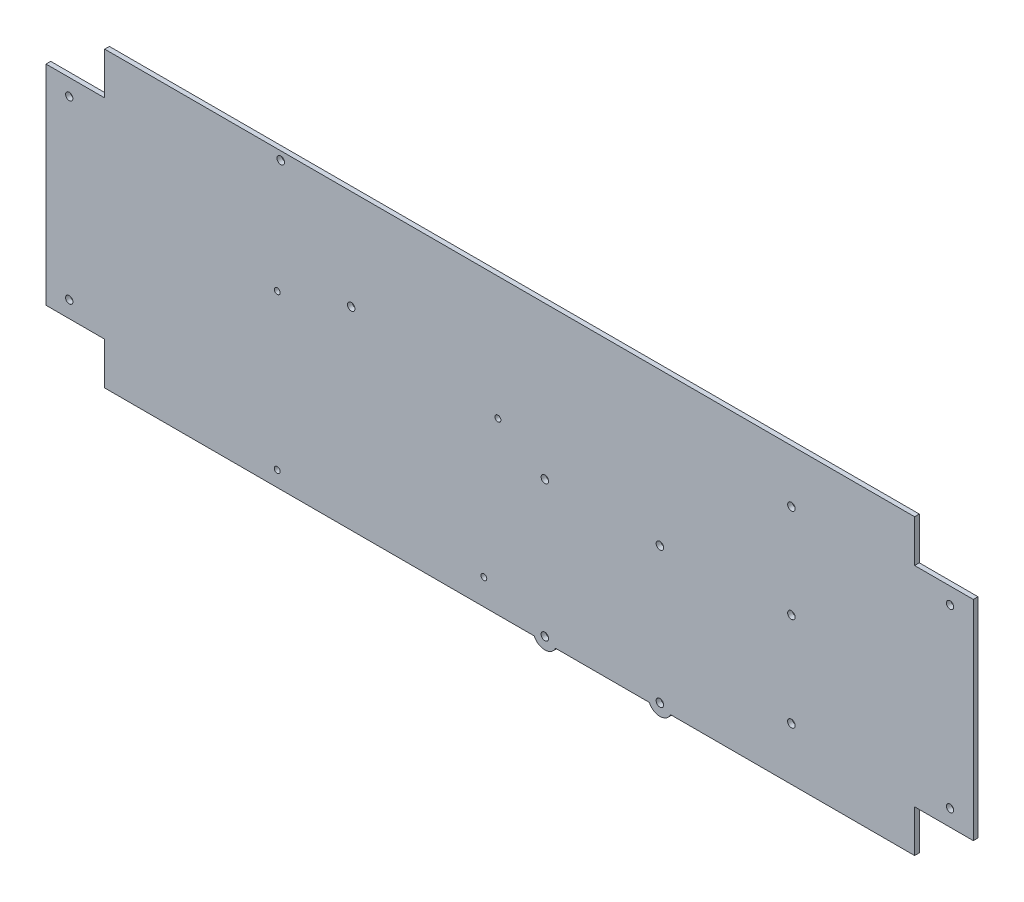
ISO-10303-21;
HEADER;
FILE_DESCRIPTION(('STEP AP214'),'2;1');
FILE_NAME('part.step','',(''),(''),'','','');
FILE_SCHEMA(('AUTOMOTIVE_DESIGN { 1 0 10303 214 1 1 1 1 }'));
ENDSEC;
DATA;
#1=APPLICATION_CONTEXT('core data for automotive mechanical design processes');
#2=APPLICATION_PROTOCOL_DEFINITION('international standard','automotive_design',2000,#1);
#3=PRODUCT_CONTEXT('',#1,'mechanical');
#4=PRODUCT('Part','Part','',(#3));
#5=PRODUCT_RELATED_PRODUCT_CATEGORY('part','',(#4));
#6=PRODUCT_DEFINITION_FORMATION('','',#4);
#7=PRODUCT_DEFINITION_CONTEXT('part definition',#1,'design');
#8=PRODUCT_DEFINITION('design','',#6,#7);
#9=PRODUCT_DEFINITION_SHAPE('','',#8);
#10=(LENGTH_UNIT() NAMED_UNIT(*) SI_UNIT(.MILLI.,.METRE.));
#11=(NAMED_UNIT(*) PLANE_ANGLE_UNIT() SI_UNIT($,.RADIAN.));
#12=(NAMED_UNIT(*) SI_UNIT($,.STERADIAN.) SOLID_ANGLE_UNIT());
#13=UNCERTAINTY_MEASURE_WITH_UNIT(LENGTH_MEASURE(1.E-05),#10,'distance_accuracy_value','');
#14=(GEOMETRIC_REPRESENTATION_CONTEXT(3) GLOBAL_UNCERTAINTY_ASSIGNED_CONTEXT((#13)) GLOBAL_UNIT_ASSIGNED_CONTEXT((#10,
#11,#12)) REPRESENTATION_CONTEXT('',''));
#15=CARTESIAN_POINT('',(0.,0.,0.));
#16=DIRECTION('',(0.,0.,1.));
#17=DIRECTION('',(1.,0.,0.));
#18=AXIS2_PLACEMENT_3D('',#15,#16,#17);
#19=CARTESIAN_POINT('',(-197.5,-62.5,2.));
#20=DIRECTION('',(0.,1.,0.));
#21=DIRECTION('',(0.,0.,1.));
#22=AXIS2_PLACEMENT_3D('',#19,#20,#21);
#23=PLANE('',#22);
#24=DIRECTION('',(1.,0.,0.));
#25=VECTOR('',#24,1.);
#26=CARTESIAN_POINT('',(-197.5,-62.5,0.));
#27=LINE('',#26,#25);
#28=CARTESIAN_POINT('',(-172.5,-62.5,0.));
#29=VERTEX_POINT('',#28);
#30=CARTESIAN_POINT('',(10.4623794781846,-62.5,0.));
#31=VERTEX_POINT('',#30);
#32=EDGE_CURVE('E39',#29,#31,#27,.T.);
#33=ORIENTED_EDGE('',*,*,#32,.T.);
#34=DIRECTION('',(0.,0.,1.));
#35=VECTOR('',#34,1.);
#36=CARTESIAN_POINT('',(10.4623794781846,-62.5,-9.52732911156111));
#37=LINE('',#36,#35);
#38=CARTESIAN_POINT('',(10.4623794781846,-62.5,2.));
#39=VERTEX_POINT('',#38);
#40=EDGE_CURVE('E60',#31,#39,#37,.T.);
#41=ORIENTED_EDGE('',*,*,#40,.T.);
#42=DIRECTION('',(1.,0.,0.));
#43=VECTOR('',#42,1.);
#44=CARTESIAN_POINT('',(-197.5,-62.5,2.));
#45=LINE('',#44,#43);
#46=CARTESIAN_POINT('',(-172.5,-62.5,2.));
#47=VERTEX_POINT('',#46);
#48=EDGE_CURVE('E11',#47,#39,#45,.T.);
#49=ORIENTED_EDGE('',*,*,#48,.F.);
#50=DIRECTION('',(0.,0.,1.));
#51=VECTOR('',#50,1.);
#52=CARTESIAN_POINT('',(-172.5,-62.5,0.));
#53=LINE('',#52,#51);
#54=EDGE_CURVE('E303',#29,#47,#53,.T.);
#55=ORIENTED_EDGE('',*,*,#54,.F.);
#56=EDGE_LOOP('',(#33,#41,#49,#55));
#57=FACE_BOUND('',#56,.T.);
#58=ADVANCED_FACE('F35',(#57),#23,.F.);
#59=CARTESIAN_POINT('',(19.5376205218153,-62.5,2.));
#60=VERTEX_POINT('',#59);
#61=CARTESIAN_POINT('',(59.4623794781845,-62.5,2.));
#62=VERTEX_POINT('',#61);
#63=EDGE_CURVE('E44',#60,#62,#45,.T.);
#64=ORIENTED_EDGE('',*,*,#63,.F.);
#65=DIRECTION('',(0.,0.,1.));
#66=VECTOR('',#65,1.);
#67=CARTESIAN_POINT('',(19.5376205218154,-62.5,-9.52732911156111));
#68=LINE('',#67,#66);
#69=CARTESIAN_POINT('',(19.5376205218154,-62.5,0.));
#70=VERTEX_POINT('',#69);
#71=EDGE_CURVE('E161',#70,#60,#68,.T.);
#72=ORIENTED_EDGE('',*,*,#71,.F.);
#73=CARTESIAN_POINT('',(59.4623794781845,-62.5,0.));
#74=VERTEX_POINT('',#73);
#75=EDGE_CURVE('E151',#70,#74,#27,.T.);
#76=ORIENTED_EDGE('',*,*,#75,.T.);
#77=DIRECTION('',(0.,0.,1.));
#78=VECTOR('',#77,1.);
#79=CARTESIAN_POINT('',(59.4623794781846,-62.5,-9.52732911156111));
#80=LINE('',#79,#78);
#81=EDGE_CURVE('E178',#74,#62,#80,.T.);
#82=ORIENTED_EDGE('',*,*,#81,.T.);
#83=EDGE_LOOP('',(#64,#72,#76,#82));
#84=FACE_BOUND('',#83,.T.);
#85=ADVANCED_FACE('F162',(#84),#23,.F.);
#86=CARTESIAN_POINT('',(0.,0.,2.));
#87=DIRECTION('',(0.,0.,1.));
#88=DIRECTION('',(1.,0.,0.));
#89=AXIS2_PLACEMENT_3D('',#86,#87,#88);
#90=PLANE('',#89);
#91=CARTESIAN_POINT('',(120.,-40.,2.));
#92=DIRECTION('',(0.,0.,1.));
#93=DIRECTION('',(1.,0.,0.));
#94=AXIS2_PLACEMENT_3D('',#91,#92,#93);
#95=CIRCLE('',#94,1.59999999999999);
#96=CARTESIAN_POINT('',(121.6,-40.,2.));
#97=VERTEX_POINT('',#96);
#98=EDGE_CURVE('E177',#97,#97,#95,.T.);
#99=ORIENTED_EDGE('',*,*,#98,.F.);
#100=EDGE_LOOP('',(#99));
#101=FACE_BOUND('',#100,.T.);
#102=CARTESIAN_POINT('',(120.,40.,2.));
#103=DIRECTION('',(0.,0.,1.));
#104=DIRECTION('',(1.,0.,0.));
#105=AXIS2_PLACEMENT_3D('',#102,#103,#104);
#106=CIRCLE('',#105,1.59999999999999);
#107=CARTESIAN_POINT('',(121.6,40.,2.));
#108=VERTEX_POINT('',#107);
#109=EDGE_CURVE('E186',#108,#108,#106,.T.);
#110=ORIENTED_EDGE('',*,*,#109,.F.);
#111=EDGE_LOOP('',(#110));
#112=FACE_BOUND('',#111,.T.);
#113=CARTESIAN_POINT('',(120.,0.,2.));
#114=DIRECTION('',(0.,0.,1.));
#115=DIRECTION('',(1.,0.,0.));
#116=AXIS2_PLACEMENT_3D('',#113,#114,#115);
#117=CIRCLE('',#116,1.59999999999999);
#118=CARTESIAN_POINT('',(121.6,0.,2.));
#119=VERTEX_POINT('',#118);
#120=EDGE_CURVE('E192',#119,#119,#117,.T.);
#121=ORIENTED_EDGE('',*,*,#120,.F.);
#122=EDGE_LOOP('',(#121));
#123=FACE_BOUND('',#122,.T.);
#124=CARTESIAN_POINT('',(-67.5,20.,2.));
#125=DIRECTION('',(0.,0.,1.));
#126=DIRECTION('',(1.,0.,0.));
#127=AXIS2_PLACEMENT_3D('',#124,#125,#126);
#128=CIRCLE('',#127,1.6);
#129=CARTESIAN_POINT('',(-65.9,20.,2.));
#130=VERTEX_POINT('',#129);
#131=EDGE_CURVE('E198',#130,#130,#128,.T.);
#132=ORIENTED_EDGE('',*,*,#131,.F.);
#133=EDGE_LOOP('',(#132));
#134=FACE_BOUND('',#133,.T.);
#135=CARTESIAN_POINT('',(-97.5,59.,2.));
#136=DIRECTION('',(0.,0.,1.));
#137=DIRECTION('',(1.,0.,0.));
#138=AXIS2_PLACEMENT_3D('',#135,#136,#137);
#139=CIRCLE('',#138,1.60000000000001);
#140=CARTESIAN_POINT('',(-95.9,59.,2.));
#141=VERTEX_POINT('',#140);
#142=EDGE_CURVE('E204',#141,#141,#139,.T.);
#143=ORIENTED_EDGE('',*,*,#142,.F.);
#144=EDGE_LOOP('',(#143));
#145=FACE_BOUND('',#144,.T.);
#146=CARTESIAN_POINT('',(64.,-60.4,2.));
#147=DIRECTION('',(0.,0.,1.));
#148=DIRECTION('',(1.,0.,0.));
#149=AXIS2_PLACEMENT_3D('',#146,#147,#148);
#150=CIRCLE('',#149,1.60000000000001);
#151=CARTESIAN_POINT('',(65.6,-60.4,2.));
#152=VERTEX_POINT('',#151);
#153=EDGE_CURVE('E210',#152,#152,#150,.T.);
#154=ORIENTED_EDGE('',*,*,#153,.F.);
#155=EDGE_LOOP('',(#154));
#156=FACE_BOUND('',#155,.T.);
#157=CARTESIAN_POINT('',(64.,-2.4,2.));
#158=DIRECTION('',(0.,0.,1.));
#159=DIRECTION('',(1.,0.,0.));
#160=AXIS2_PLACEMENT_3D('',#157,#158,#159);
#161=CIRCLE('',#160,1.59999999999999);
#162=CARTESIAN_POINT('',(65.6,-2.4,2.));
#163=VERTEX_POINT('',#162);
#164=EDGE_CURVE('E216',#163,#163,#161,.T.);
#165=ORIENTED_EDGE('',*,*,#164,.F.);
#166=EDGE_LOOP('',(#165));
#167=FACE_BOUND('',#166,.T.);
#168=CARTESIAN_POINT('',(15.,-60.4,2.));
#169=DIRECTION('',(0.,0.,1.));
#170=DIRECTION('',(1.,0.,0.));
#171=AXIS2_PLACEMENT_3D('',#168,#169,#170);
#172=CIRCLE('',#171,1.6);
#173=CARTESIAN_POINT('',(16.6,-60.4,2.));
#174=VERTEX_POINT('',#173);
#175=EDGE_CURVE('E222',#174,#174,#172,.T.);
#176=ORIENTED_EDGE('',*,*,#175,.F.);
#177=EDGE_LOOP('',(#176));
#178=FACE_BOUND('',#177,.T.);
#179=CARTESIAN_POINT('',(15.,-2.4,2.));
#180=DIRECTION('',(0.,0.,1.));
#181=DIRECTION('',(1.,0.,0.));
#182=AXIS2_PLACEMENT_3D('',#179,#180,#181);
#183=CIRCLE('',#182,1.6);
#184=CARTESIAN_POINT('',(16.6,-2.4,2.));
#185=VERTEX_POINT('',#184);
#186=EDGE_CURVE('E228',#185,#185,#183,.T.);
#187=ORIENTED_EDGE('',*,*,#186,.F.);
#188=EDGE_LOOP('',(#187));
#189=FACE_BOUND('',#188,.T.);
#190=CARTESIAN_POINT('',(-11.,-51.5,2.));
#191=DIRECTION('',(0.,0.,1.));
#192=DIRECTION('',(1.,0.,0.));
#193=AXIS2_PLACEMENT_3D('',#190,#191,#192);
#194=CIRCLE('',#193,1.25);
#195=CARTESIAN_POINT('',(-9.75,-51.5,2.));
#196=VERTEX_POINT('',#195);
#197=EDGE_CURVE('E234',#196,#196,#194,.T.);
#198=ORIENTED_EDGE('',*,*,#197,.F.);
#199=EDGE_LOOP('',(#198));
#200=FACE_BOUND('',#199,.T.);
#201=CARTESIAN_POINT('',(-5.,10.,2.));
#202=DIRECTION('',(0.,0.,1.));
#203=DIRECTION('',(1.,0.,0.));
#204=AXIS2_PLACEMENT_3D('',#201,#202,#203);
#205=CIRCLE('',#204,1.25);
#206=CARTESIAN_POINT('',(-3.75,10.,2.));
#207=VERTEX_POINT('',#206);
#208=EDGE_CURVE('E240',#207,#207,#205,.T.);
#209=ORIENTED_EDGE('',*,*,#208,.F.);
#210=EDGE_LOOP('',(#209));
#211=FACE_BOUND('',#210,.T.);
#212=CARTESIAN_POINT('',(-99.,-56.,2.));
#213=DIRECTION('',(0.,0.,1.));
#214=DIRECTION('',(1.,0.,0.));
#215=AXIS2_PLACEMENT_3D('',#212,#213,#214);
#216=CIRCLE('',#215,1.25);
#217=CARTESIAN_POINT('',(-97.75,-56.,2.));
#218=VERTEX_POINT('',#217);
#219=EDGE_CURVE('E246',#218,#218,#216,.T.);
#220=ORIENTED_EDGE('',*,*,#219,.F.);
#221=EDGE_LOOP('',(#220));
#222=FACE_BOUND('',#221,.T.);
#223=CARTESIAN_POINT('',(-99.,10.,2.));
#224=DIRECTION('',(0.,0.,1.));
#225=DIRECTION('',(1.,0.,0.));
#226=AXIS2_PLACEMENT_3D('',#223,#224,#225);
#227=CIRCLE('',#226,1.25);
#228=CARTESIAN_POINT('',(-97.75,10.,2.));
#229=VERTEX_POINT('',#228);
#230=EDGE_CURVE('E252',#229,#229,#227,.T.);
#231=ORIENTED_EDGE('',*,*,#230,.F.);
#232=EDGE_LOOP('',(#231));
#233=FACE_BOUND('',#232,.T.);
#234=CARTESIAN_POINT('',(187.6,-37.5,2.));
#235=DIRECTION('',(0.,0.,1.));
#236=DIRECTION('',(1.,0.,0.));
#237=AXIS2_PLACEMENT_3D('',#234,#235,#236);
#238=CIRCLE('',#237,1.54999999999999);
#239=CARTESIAN_POINT('',(189.15,-37.5,2.));
#240=VERTEX_POINT('',#239);
#241=EDGE_CURVE('E330',#240,#240,#238,.T.);
#242=ORIENTED_EDGE('',*,*,#241,.F.);
#243=EDGE_LOOP('',(#242));
#244=FACE_BOUND('',#243,.T.);
#245=CARTESIAN_POINT('',(187.6,37.5,2.));
#246=DIRECTION('',(0.,0.,1.));
#247=DIRECTION('',(1.,0.,0.));
#248=AXIS2_PLACEMENT_3D('',#245,#246,#247);
#249=CIRCLE('',#248,1.54999999999999);
#250=CARTESIAN_POINT('',(189.15,37.5,2.));
#251=VERTEX_POINT('',#250);
#252=EDGE_CURVE('E337',#251,#251,#249,.T.);
#253=ORIENTED_EDGE('',*,*,#252,.F.);
#254=EDGE_LOOP('',(#253));
#255=FACE_BOUND('',#254,.T.);
#256=CARTESIAN_POINT('',(-187.6,-37.5,2.));
#257=DIRECTION('',(0.,0.,1.));
#258=DIRECTION('',(1.,0.,0.));
#259=AXIS2_PLACEMENT_3D('',#256,#257,#258);
#260=CIRCLE('',#259,1.55);
#261=CARTESIAN_POINT('',(-186.05,-37.5,2.));
#262=VERTEX_POINT('',#261);
#263=EDGE_CURVE('E343',#262,#262,#260,.T.);
#264=ORIENTED_EDGE('',*,*,#263,.F.);
#265=EDGE_LOOP('',(#264));
#266=FACE_BOUND('',#265,.T.);
#267=CARTESIAN_POINT('',(-187.6,37.5,2.));
#268=DIRECTION('',(0.,0.,1.));
#269=DIRECTION('',(1.,0.,0.));
#270=AXIS2_PLACEMENT_3D('',#267,#268,#269);
#271=CIRCLE('',#270,1.55);
#272=CARTESIAN_POINT('',(-186.05,37.5,2.));
#273=VERTEX_POINT('',#272);
#274=EDGE_CURVE('E349',#273,#273,#271,.T.);
#275=ORIENTED_EDGE('',*,*,#274,.F.);
#276=EDGE_LOOP('',(#275));
#277=FACE_BOUND('',#276,.T.);
#278=DIRECTION('',(0.,1.,0.));
#279=VECTOR('',#278,1.);
#280=CARTESIAN_POINT('',(197.5,62.5,2.));
#281=LINE('',#280,#279);
#282=CARTESIAN_POINT('',(197.5,-44.5,2.));
#283=VERTEX_POINT('',#282);
#284=CARTESIAN_POINT('',(197.5,44.5,2.));
#285=VERTEX_POINT('',#284);
#286=EDGE_CURVE('E358',#283,#285,#281,.T.);
#287=ORIENTED_EDGE('',*,*,#286,.T.);
#288=DIRECTION('',(-1.,0.,0.));
#289=VECTOR('',#288,1.);
#290=CARTESIAN_POINT('',(197.5,44.5,2.));
#291=LINE('',#290,#289);
#292=CARTESIAN_POINT('',(172.5,44.5,2.));
#293=VERTEX_POINT('',#292);
#294=EDGE_CURVE('E264',#285,#293,#291,.T.);
#295=ORIENTED_EDGE('',*,*,#294,.T.);
#296=DIRECTION('',(0.,1.,0.));
#297=VECTOR('',#296,1.);
#298=CARTESIAN_POINT('',(172.5,62.5,2.));
#299=LINE('',#298,#297);
#300=CARTESIAN_POINT('',(172.5,62.5,2.));
#301=VERTEX_POINT('',#300);
#302=EDGE_CURVE('E258',#293,#301,#299,.T.);
#303=ORIENTED_EDGE('',*,*,#302,.T.);
#304=DIRECTION('',(-1.,0.,0.));
#305=VECTOR('',#304,1.);
#306=CARTESIAN_POINT('',(-197.5,62.5,2.));
#307=LINE('',#306,#305);
#308=CARTESIAN_POINT('',(-172.5,62.5,2.));
#309=VERTEX_POINT('',#308);
#310=EDGE_CURVE('E361',#301,#309,#307,.T.);
#311=ORIENTED_EDGE('',*,*,#310,.T.);
#312=DIRECTION('',(0.,1.,0.));
#313=VECTOR('',#312,1.);
#314=CARTESIAN_POINT('',(-172.5,62.5,2.));
#315=LINE('',#314,#313);
#316=CARTESIAN_POINT('',(-172.5,44.5,2.));
#317=VERTEX_POINT('',#316);
#318=EDGE_CURVE('E319',#317,#309,#315,.T.);
#319=ORIENTED_EDGE('',*,*,#318,.F.);
#320=DIRECTION('',(1.,0.,0.));
#321=VECTOR('',#320,1.);
#322=CARTESIAN_POINT('',(-197.5,44.5,2.));
#323=LINE('',#322,#321);
#324=CARTESIAN_POINT('',(-197.5,44.5,2.));
#325=VERTEX_POINT('',#324);
#326=EDGE_CURVE('E311',#325,#317,#323,.T.);
#327=ORIENTED_EDGE('',*,*,#326,.F.);
#328=DIRECTION('',(0.,-1.,0.));
#329=VECTOR('',#328,1.);
#330=CARTESIAN_POINT('',(-197.5,62.5,2.));
#331=LINE('',#330,#329);
#332=CARTESIAN_POINT('',(-197.5,-44.5,2.));
#333=VERTEX_POINT('',#332);
#334=EDGE_CURVE('E363',#325,#333,#331,.T.);
#335=ORIENTED_EDGE('',*,*,#334,.T.);
#336=DIRECTION('',(1.,0.,0.));
#337=VECTOR('',#336,1.);
#338=CARTESIAN_POINT('',(-197.5,-44.5,2.));
#339=LINE('',#338,#337);
#340=CARTESIAN_POINT('',(-172.5,-44.5,2.));
#341=VERTEX_POINT('',#340);
#342=EDGE_CURVE('E300',#333,#341,#339,.T.);
#343=ORIENTED_EDGE('',*,*,#342,.T.);
#344=DIRECTION('',(0.,-1.,0.));
#345=VECTOR('',#344,1.);
#346=CARTESIAN_POINT('',(-172.5,-62.5,2.));
#347=LINE('',#346,#345);
#348=EDGE_CURVE('E293',#341,#47,#347,.T.);
#349=ORIENTED_EDGE('',*,*,#348,.T.);
#350=ORIENTED_EDGE('',*,*,#48,.T.);
#351=CARTESIAN_POINT('',(15.,-60.4,2.));
#352=DIRECTION('',(0.,0.,1.));
#353=DIRECTION('',(1.,0.,0.));
#354=AXIS2_PLACEMENT_3D('',#351,#352,#353);
#355=CIRCLE('',#354,5.);
#356=EDGE_CURVE('E166',#39,#60,#355,.T.);
#357=ORIENTED_EDGE('',*,*,#356,.T.);
#358=ORIENTED_EDGE('',*,*,#63,.T.);
#359=CARTESIAN_POINT('',(64.,-60.4,2.));
#360=DIRECTION('',(0.,0.,1.));
#361=DIRECTION('',(1.,0.,0.));
#362=AXIS2_PLACEMENT_3D('',#359,#360,#361);
#363=CIRCLE('',#362,4.99999999999999);
#364=CARTESIAN_POINT('',(68.5376205218153,-62.5,2.));
#365=VERTEX_POINT('',#364);
#366=EDGE_CURVE('E169',#62,#365,#363,.T.);
#367=ORIENTED_EDGE('',*,*,#366,.T.);
#368=CARTESIAN_POINT('',(172.5,-62.5,2.));
#369=VERTEX_POINT('',#368);
#370=EDGE_CURVE('E46',#365,#369,#45,.T.);
#371=ORIENTED_EDGE('',*,*,#370,.T.);
#372=DIRECTION('',(0.,-1.,0.));
#373=VECTOR('',#372,1.);
#374=CARTESIAN_POINT('',(172.5,-62.5,2.));
#375=LINE('',#374,#373);
#376=CARTESIAN_POINT('',(172.5,-44.5,2.));
#377=VERTEX_POINT('',#376);
#378=EDGE_CURVE('E282',#377,#369,#375,.T.);
#379=ORIENTED_EDGE('',*,*,#378,.F.);
#380=DIRECTION('',(-1.,0.,0.));
#381=VECTOR('',#380,1.);
#382=CARTESIAN_POINT('',(197.5,-44.5,2.));
#383=LINE('',#382,#381);
#384=EDGE_CURVE('E274',#283,#377,#383,.T.);
#385=ORIENTED_EDGE('',*,*,#384,.F.);
#386=EDGE_LOOP('',(#287,#295,#303,#311,#319,#327,#335,#343,#349,#350,#357,#358,#367,#371,#379,#385));
#387=FACE_BOUND('',#386,.T.);
#388=ADVANCED_FACE('F389',(#101,#112,#123,#134,#145,#156,#167,#178,#189,#200,#211,#222,#233,
#244,#255,#266,#277,#387),#90,.T.);
#389=CARTESIAN_POINT('',(0.,0.,0.));
#390=DIRECTION('',(0.,0.,1.));
#391=DIRECTION('',(1.,0.,0.));
#392=AXIS2_PLACEMENT_3D('',#389,#390,#391);
#393=PLANE('',#392);
#394=CARTESIAN_POINT('',(120.,-40.,0.));
#395=DIRECTION('',(0.,0.,1.));
#396=DIRECTION('',(1.,0.,0.));
#397=AXIS2_PLACEMENT_3D('',#394,#395,#396);
#398=CIRCLE('',#397,1.59999999999999);
#399=CARTESIAN_POINT('',(121.6,-40.,0.));
#400=VERTEX_POINT('',#399);
#401=EDGE_CURVE('E183',#400,#400,#398,.T.);
#402=ORIENTED_EDGE('',*,*,#401,.T.);
#403=EDGE_LOOP('',(#402));
#404=FACE_BOUND('',#403,.T.);
#405=CARTESIAN_POINT('',(120.,40.,0.));
#406=DIRECTION('',(0.,0.,1.));
#407=DIRECTION('',(1.,0.,0.));
#408=AXIS2_PLACEMENT_3D('',#405,#406,#407);
#409=CIRCLE('',#408,1.59999999999999);
#410=CARTESIAN_POINT('',(121.6,40.,0.));
#411=VERTEX_POINT('',#410);
#412=EDGE_CURVE('E189',#411,#411,#409,.T.);
#413=ORIENTED_EDGE('',*,*,#412,.T.);
#414=EDGE_LOOP('',(#413));
#415=FACE_BOUND('',#414,.T.);
#416=CARTESIAN_POINT('',(120.,0.,0.));
#417=DIRECTION('',(0.,0.,1.));
#418=DIRECTION('',(1.,0.,0.));
#419=AXIS2_PLACEMENT_3D('',#416,#417,#418);
#420=CIRCLE('',#419,1.59999999999999);
#421=CARTESIAN_POINT('',(121.6,0.,0.));
#422=VERTEX_POINT('',#421);
#423=EDGE_CURVE('E195',#422,#422,#420,.T.);
#424=ORIENTED_EDGE('',*,*,#423,.T.);
#425=EDGE_LOOP('',(#424));
#426=FACE_BOUND('',#425,.T.);
#427=CARTESIAN_POINT('',(-67.5,20.,0.));
#428=DIRECTION('',(0.,0.,1.));
#429=DIRECTION('',(1.,0.,0.));
#430=AXIS2_PLACEMENT_3D('',#427,#428,#429);
#431=CIRCLE('',#430,1.6);
#432=CARTESIAN_POINT('',(-65.9,20.,0.));
#433=VERTEX_POINT('',#432);
#434=EDGE_CURVE('E201',#433,#433,#431,.T.);
#435=ORIENTED_EDGE('',*,*,#434,.T.);
#436=EDGE_LOOP('',(#435));
#437=FACE_BOUND('',#436,.T.);
#438=CARTESIAN_POINT('',(-97.5,59.,0.));
#439=DIRECTION('',(0.,0.,1.));
#440=DIRECTION('',(1.,0.,0.));
#441=AXIS2_PLACEMENT_3D('',#438,#439,#440);
#442=CIRCLE('',#441,1.60000000000001);
#443=CARTESIAN_POINT('',(-95.9,59.,0.));
#444=VERTEX_POINT('',#443);
#445=EDGE_CURVE('E207',#444,#444,#442,.T.);
#446=ORIENTED_EDGE('',*,*,#445,.T.);
#447=EDGE_LOOP('',(#446));
#448=FACE_BOUND('',#447,.T.);
#449=CARTESIAN_POINT('',(64.,-60.4,0.));
#450=DIRECTION('',(0.,0.,1.));
#451=DIRECTION('',(1.,0.,0.));
#452=AXIS2_PLACEMENT_3D('',#449,#450,#451);
#453=CIRCLE('',#452,1.60000000000001);
#454=CARTESIAN_POINT('',(65.6,-60.4,0.));
#455=VERTEX_POINT('',#454);
#456=EDGE_CURVE('E213',#455,#455,#453,.T.);
#457=ORIENTED_EDGE('',*,*,#456,.T.);
#458=EDGE_LOOP('',(#457));
#459=FACE_BOUND('',#458,.T.);
#460=CARTESIAN_POINT('',(64.,-2.4,0.));
#461=DIRECTION('',(0.,0.,1.));
#462=DIRECTION('',(1.,0.,0.));
#463=AXIS2_PLACEMENT_3D('',#460,#461,#462);
#464=CIRCLE('',#463,1.59999999999999);
#465=CARTESIAN_POINT('',(65.6,-2.4,0.));
#466=VERTEX_POINT('',#465);
#467=EDGE_CURVE('E219',#466,#466,#464,.T.);
#468=ORIENTED_EDGE('',*,*,#467,.T.);
#469=EDGE_LOOP('',(#468));
#470=FACE_BOUND('',#469,.T.);
#471=CARTESIAN_POINT('',(15.,-60.4,0.));
#472=DIRECTION('',(0.,0.,1.));
#473=DIRECTION('',(1.,0.,0.));
#474=AXIS2_PLACEMENT_3D('',#471,#472,#473);
#475=CIRCLE('',#474,1.6);
#476=CARTESIAN_POINT('',(16.6,-60.4,0.));
#477=VERTEX_POINT('',#476);
#478=EDGE_CURVE('E225',#477,#477,#475,.T.);
#479=ORIENTED_EDGE('',*,*,#478,.T.);
#480=EDGE_LOOP('',(#479));
#481=FACE_BOUND('',#480,.T.);
#482=CARTESIAN_POINT('',(15.,-2.4,0.));
#483=DIRECTION('',(0.,0.,1.));
#484=DIRECTION('',(1.,0.,0.));
#485=AXIS2_PLACEMENT_3D('',#482,#483,#484);
#486=CIRCLE('',#485,1.6);
#487=CARTESIAN_POINT('',(16.6,-2.4,0.));
#488=VERTEX_POINT('',#487);
#489=EDGE_CURVE('E231',#488,#488,#486,.T.);
#490=ORIENTED_EDGE('',*,*,#489,.T.);
#491=EDGE_LOOP('',(#490));
#492=FACE_BOUND('',#491,.T.);
#493=CARTESIAN_POINT('',(-11.,-51.5,0.));
#494=DIRECTION('',(0.,0.,1.));
#495=DIRECTION('',(1.,0.,0.));
#496=AXIS2_PLACEMENT_3D('',#493,#494,#495);
#497=CIRCLE('',#496,1.25);
#498=CARTESIAN_POINT('',(-9.75,-51.5,0.));
#499=VERTEX_POINT('',#498);
#500=EDGE_CURVE('E237',#499,#499,#497,.T.);
#501=ORIENTED_EDGE('',*,*,#500,.T.);
#502=EDGE_LOOP('',(#501));
#503=FACE_BOUND('',#502,.T.);
#504=CARTESIAN_POINT('',(-5.,10.,0.));
#505=DIRECTION('',(0.,0.,1.));
#506=DIRECTION('',(1.,0.,0.));
#507=AXIS2_PLACEMENT_3D('',#504,#505,#506);
#508=CIRCLE('',#507,1.25);
#509=CARTESIAN_POINT('',(-3.75,10.,0.));
#510=VERTEX_POINT('',#509);
#511=EDGE_CURVE('E243',#510,#510,#508,.T.);
#512=ORIENTED_EDGE('',*,*,#511,.T.);
#513=EDGE_LOOP('',(#512));
#514=FACE_BOUND('',#513,.T.);
#515=CARTESIAN_POINT('',(-99.,-56.,0.));
#516=DIRECTION('',(0.,0.,1.));
#517=DIRECTION('',(1.,0.,0.));
#518=AXIS2_PLACEMENT_3D('',#515,#516,#517);
#519=CIRCLE('',#518,1.25);
#520=CARTESIAN_POINT('',(-97.75,-56.,0.));
#521=VERTEX_POINT('',#520);
#522=EDGE_CURVE('E249',#521,#521,#519,.T.);
#523=ORIENTED_EDGE('',*,*,#522,.T.);
#524=EDGE_LOOP('',(#523));
#525=FACE_BOUND('',#524,.T.);
#526=CARTESIAN_POINT('',(-99.,10.,0.));
#527=DIRECTION('',(0.,0.,1.));
#528=DIRECTION('',(1.,0.,0.));
#529=AXIS2_PLACEMENT_3D('',#526,#527,#528);
#530=CIRCLE('',#529,1.25);
#531=CARTESIAN_POINT('',(-97.75,10.,0.));
#532=VERTEX_POINT('',#531);
#533=EDGE_CURVE('E255',#532,#532,#530,.T.);
#534=ORIENTED_EDGE('',*,*,#533,.T.);
#535=EDGE_LOOP('',(#534));
#536=FACE_BOUND('',#535,.T.);
#537=CARTESIAN_POINT('',(187.6,-37.5,0.));
#538=DIRECTION('',(0.,0.,1.));
#539=DIRECTION('',(1.,0.,0.));
#540=AXIS2_PLACEMENT_3D('',#537,#538,#539);
#541=CIRCLE('',#540,1.54999999999999);
#542=CARTESIAN_POINT('',(189.15,-37.5,0.));
#543=VERTEX_POINT('',#542);
#544=EDGE_CURVE('E334',#543,#543,#541,.T.);
#545=ORIENTED_EDGE('',*,*,#544,.T.);
#546=EDGE_LOOP('',(#545));
#547=FACE_BOUND('',#546,.T.);
#548=CARTESIAN_POINT('',(187.6,37.5,0.));
#549=DIRECTION('',(0.,0.,1.));
#550=DIRECTION('',(1.,0.,0.));
#551=AXIS2_PLACEMENT_3D('',#548,#549,#550);
#552=CIRCLE('',#551,1.54999999999999);
#553=CARTESIAN_POINT('',(189.15,37.5,0.));
#554=VERTEX_POINT('',#553);
#555=EDGE_CURVE('E340',#554,#554,#552,.T.);
#556=ORIENTED_EDGE('',*,*,#555,.T.);
#557=EDGE_LOOP('',(#556));
#558=FACE_BOUND('',#557,.T.);
#559=CARTESIAN_POINT('',(-187.6,-37.5,0.));
#560=DIRECTION('',(0.,0.,1.));
#561=DIRECTION('',(1.,0.,0.));
#562=AXIS2_PLACEMENT_3D('',#559,#560,#561);
#563=CIRCLE('',#562,1.55);
#564=CARTESIAN_POINT('',(-186.05,-37.5,0.));
#565=VERTEX_POINT('',#564);
#566=EDGE_CURVE('E346',#565,#565,#563,.T.);
#567=ORIENTED_EDGE('',*,*,#566,.T.);
#568=EDGE_LOOP('',(#567));
#569=FACE_BOUND('',#568,.T.);
#570=CARTESIAN_POINT('',(-187.6,37.5,0.));
#571=DIRECTION('',(0.,0.,1.));
#572=DIRECTION('',(1.,0.,0.));
#573=AXIS2_PLACEMENT_3D('',#570,#571,#572);
#574=CIRCLE('',#573,1.55);
#575=CARTESIAN_POINT('',(-186.05,37.5,0.));
#576=VERTEX_POINT('',#575);
#577=EDGE_CURVE('E352',#576,#576,#574,.T.);
#578=ORIENTED_EDGE('',*,*,#577,.T.);
#579=EDGE_LOOP('',(#578));
#580=FACE_BOUND('',#579,.T.);
#581=DIRECTION('',(-1.,0.,0.));
#582=VECTOR('',#581,1.);
#583=CARTESIAN_POINT('',(197.5,44.5,0.));
#584=LINE('',#583,#582);
#585=CARTESIAN_POINT('',(197.5,44.5,0.));
#586=VERTEX_POINT('',#585);
#587=CARTESIAN_POINT('',(172.5,44.5,0.));
#588=VERTEX_POINT('',#587);
#589=EDGE_CURVE('E263',#586,#588,#584,.T.);
#590=ORIENTED_EDGE('',*,*,#589,.F.);
#591=DIRECTION('',(0.,1.,0.));
#592=VECTOR('',#591,1.);
#593=CARTESIAN_POINT('',(197.5,62.5,0.));
#594=LINE('',#593,#592);
#595=CARTESIAN_POINT('',(197.5,-44.5,0.));
#596=VERTEX_POINT('',#595);
#597=EDGE_CURVE('E355',#596,#586,#594,.T.);
#598=ORIENTED_EDGE('',*,*,#597,.F.);
#599=DIRECTION('',(-1.,0.,0.));
#600=VECTOR('',#599,1.);
#601=CARTESIAN_POINT('',(197.5,-44.5,0.));
#602=LINE('',#601,#600);
#603=CARTESIAN_POINT('',(172.5,-44.5,0.));
#604=VERTEX_POINT('',#603);
#605=EDGE_CURVE('E278',#596,#604,#602,.T.);
#606=ORIENTED_EDGE('',*,*,#605,.T.);
#607=DIRECTION('',(0.,-1.,0.));
#608=VECTOR('',#607,1.);
#609=CARTESIAN_POINT('',(172.5,-62.5,0.));
#610=LINE('',#609,#608);
#611=CARTESIAN_POINT('',(172.5,-62.5,0.));
#612=VERTEX_POINT('',#611);
#613=EDGE_CURVE('E281',#604,#612,#610,.T.);
#614=ORIENTED_EDGE('',*,*,#613,.T.);
#615=CARTESIAN_POINT('',(68.5376205218154,-62.5,0.));
#616=VERTEX_POINT('',#615);
#617=EDGE_CURVE('E160',#616,#612,#27,.T.);
#618=ORIENTED_EDGE('',*,*,#617,.F.);
#619=CARTESIAN_POINT('',(64.,-60.4,0.));
#620=DIRECTION('',(0.,0.,1.));
#621=DIRECTION('',(1.,0.,0.));
#622=AXIS2_PLACEMENT_3D('',#619,#620,#621);
#623=CIRCLE('',#622,4.99999999999999);
#624=EDGE_CURVE('E158',#616,#74,#623,.F.);
#625=ORIENTED_EDGE('',*,*,#624,.T.);
#626=ORIENTED_EDGE('',*,*,#75,.F.);
#627=CARTESIAN_POINT('',(15.,-60.4,0.));
#628=DIRECTION('',(0.,0.,1.));
#629=DIRECTION('',(1.,0.,0.));
#630=AXIS2_PLACEMENT_3D('',#627,#628,#629);
#631=CIRCLE('',#630,5.);
#632=EDGE_CURVE('E156',#70,#31,#631,.F.);
#633=ORIENTED_EDGE('',*,*,#632,.T.);
#634=ORIENTED_EDGE('',*,*,#32,.F.);
#635=DIRECTION('',(0.,-1.,0.));
#636=VECTOR('',#635,1.);
#637=CARTESIAN_POINT('',(-172.5,-62.5,0.));
#638=LINE('',#637,#636);
#639=CARTESIAN_POINT('',(-172.5,-44.5,0.));
#640=VERTEX_POINT('',#639);
#641=EDGE_CURVE('E297',#640,#29,#638,.T.);
#642=ORIENTED_EDGE('',*,*,#641,.F.);
#643=DIRECTION('',(1.,0.,0.));
#644=VECTOR('',#643,1.);
#645=CARTESIAN_POINT('',(-197.5,-44.5,0.));
#646=LINE('',#645,#644);
#647=CARTESIAN_POINT('',(-197.5,-44.5,0.));
#648=VERTEX_POINT('',#647);
#649=EDGE_CURVE('E299',#648,#640,#646,.T.);
#650=ORIENTED_EDGE('',*,*,#649,.F.);
#651=DIRECTION('',(0.,-1.,0.));
#652=VECTOR('',#651,1.);
#653=CARTESIAN_POINT('',(-197.5,62.5,0.));
#654=LINE('',#653,#652);
#655=CARTESIAN_POINT('',(-197.5,44.5,0.));
#656=VERTEX_POINT('',#655);
#657=EDGE_CURVE('E369',#656,#648,#654,.T.);
#658=ORIENTED_EDGE('',*,*,#657,.F.);
#659=DIRECTION('',(1.,0.,0.));
#660=VECTOR('',#659,1.);
#661=CARTESIAN_POINT('',(-197.5,44.5,0.));
#662=LINE('',#661,#660);
#663=CARTESIAN_POINT('',(-172.5,44.5,0.));
#664=VERTEX_POINT('',#663);
#665=EDGE_CURVE('E315',#656,#664,#662,.T.);
#666=ORIENTED_EDGE('',*,*,#665,.T.);
#667=DIRECTION('',(0.,1.,0.));
#668=VECTOR('',#667,1.);
#669=CARTESIAN_POINT('',(-172.5,62.5,0.));
#670=LINE('',#669,#668);
#671=CARTESIAN_POINT('',(-172.5,62.5,0.));
#672=VERTEX_POINT('',#671);
#673=EDGE_CURVE('E318',#664,#672,#670,.T.);
#674=ORIENTED_EDGE('',*,*,#673,.T.);
#675=DIRECTION('',(-1.,0.,0.));
#676=VECTOR('',#675,1.);
#677=CARTESIAN_POINT('',(-197.5,62.5,0.));
#678=LINE('',#677,#676);
#679=CARTESIAN_POINT('',(172.5,62.5,0.));
#680=VERTEX_POINT('',#679);
#681=EDGE_CURVE('E368',#680,#672,#678,.T.);
#682=ORIENTED_EDGE('',*,*,#681,.F.);
#683=DIRECTION('',(0.,1.,0.));
#684=VECTOR('',#683,1.);
#685=CARTESIAN_POINT('',(172.5,62.5,0.));
#686=LINE('',#685,#684);
#687=EDGE_CURVE('E261',#588,#680,#686,.T.);
#688=ORIENTED_EDGE('',*,*,#687,.F.);
#689=EDGE_LOOP('',(#590,#598,#606,#614,#618,#625,#626,#633,#634,#642,#650,#658,#666,#674,#682,#688));
#690=FACE_BOUND('',#689,.T.);
#691=ADVANCED_FACE('F153',(#404,#415,#426,#437,#448,#459,#470,#481,#492,#503,#514,#525,#536,
#547,#558,#569,#580,#690),#393,.F.);
#692=CARTESIAN_POINT('',(197.5,62.5,2.));
#693=DIRECTION('',(-1.,0.,0.));
#694=DIRECTION('',(0.,0.,1.));
#695=AXIS2_PLACEMENT_3D('',#692,#693,#694);
#696=PLANE('',#695);
#697=DIRECTION('',(0.,0.,1.));
#698=VECTOR('',#697,1.);
#699=CARTESIAN_POINT('',(197.5,44.5,0.));
#700=LINE('',#699,#698);
#701=EDGE_CURVE('E271',#586,#285,#700,.T.);
#702=ORIENTED_EDGE('',*,*,#701,.T.);
#703=ORIENTED_EDGE('',*,*,#286,.F.);
#704=DIRECTION('',(0.,0.,1.));
#705=VECTOR('',#704,1.);
#706=CARTESIAN_POINT('',(197.5,-44.5,0.));
#707=LINE('',#706,#705);
#708=EDGE_CURVE('E285',#596,#283,#707,.T.);
#709=ORIENTED_EDGE('',*,*,#708,.F.);
#710=ORIENTED_EDGE('',*,*,#597,.T.);
#711=EDGE_LOOP('',(#702,#703,#709,#710));
#712=FACE_BOUND('',#711,.T.);
#713=ADVANCED_FACE('F37',(#712),#696,.F.);
#714=CARTESIAN_POINT('',(-197.5,62.5,2.));
#715=DIRECTION('',(0.,-1.,0.));
#716=DIRECTION('',(0.,0.,-1.));
#717=AXIS2_PLACEMENT_3D('',#714,#715,#716);
#718=PLANE('',#717);
#719=DIRECTION('',(0.,0.,1.));
#720=VECTOR('',#719,1.);
#721=CARTESIAN_POINT('',(172.5,62.5,0.));
#722=LINE('',#721,#720);
#723=EDGE_CURVE('E266',#680,#301,#722,.T.);
#724=ORIENTED_EDGE('',*,*,#723,.F.);
#725=ORIENTED_EDGE('',*,*,#681,.T.);
#726=DIRECTION('',(0.,0.,1.));
#727=VECTOR('',#726,1.);
#728=CARTESIAN_POINT('',(-172.5,62.5,0.));
#729=LINE('',#728,#727);
#730=EDGE_CURVE('E327',#672,#309,#729,.T.);
#731=ORIENTED_EDGE('',*,*,#730,.T.);
#732=ORIENTED_EDGE('',*,*,#310,.F.);
#733=EDGE_LOOP('',(#724,#725,#731,#732));
#734=FACE_BOUND('',#733,.T.);
#735=ADVANCED_FACE('F402',(#734),#718,.F.);
#736=CARTESIAN_POINT('',(-197.5,62.5,2.));
#737=DIRECTION('',(1.,0.,0.));
#738=DIRECTION('',(0.,1.,0.));
#739=AXIS2_PLACEMENT_3D('',#736,#737,#738);
#740=PLANE('',#739);
#741=DIRECTION('',(0.,0.,1.));
#742=VECTOR('',#741,1.);
#743=CARTESIAN_POINT('',(-197.5,-44.5,0.));
#744=LINE('',#743,#742);
#745=EDGE_CURVE('E308',#648,#333,#744,.T.);
#746=ORIENTED_EDGE('',*,*,#745,.T.);
#747=ORIENTED_EDGE('',*,*,#334,.F.);
#748=DIRECTION('',(0.,0.,1.));
#749=VECTOR('',#748,1.);
#750=CARTESIAN_POINT('',(-197.5,44.5,0.));
#751=LINE('',#750,#749);
#752=EDGE_CURVE('E322',#656,#325,#751,.T.);
#753=ORIENTED_EDGE('',*,*,#752,.F.);
#754=ORIENTED_EDGE('',*,*,#657,.T.);
#755=EDGE_LOOP('',(#746,#747,#753,#754));
#756=FACE_BOUND('',#755,.T.);
#757=ADVANCED_FACE('F386',(#756),#740,.F.);
#758=ORIENTED_EDGE('',*,*,#370,.F.);
#759=DIRECTION('',(0.,0.,1.));
#760=VECTOR('',#759,1.);
#761=CARTESIAN_POINT('',(68.5376205218154,-62.5,-9.52732911156111));
#762=LINE('',#761,#760);
#763=EDGE_CURVE('E172',#616,#365,#762,.T.);
#764=ORIENTED_EDGE('',*,*,#763,.F.);
#765=ORIENTED_EDGE('',*,*,#617,.T.);
#766=DIRECTION('',(0.,0.,1.));
#767=VECTOR('',#766,1.);
#768=CARTESIAN_POINT('',(172.5,-62.5,0.));
#769=LINE('',#768,#767);
#770=EDGE_CURVE('E290',#612,#369,#769,.T.);
#771=ORIENTED_EDGE('',*,*,#770,.T.);
#772=EDGE_LOOP('',(#758,#764,#765,#771));
#773=FACE_BOUND('',#772,.T.);
#774=ADVANCED_FACE('F420',(#773),#23,.F.);
#775=CARTESIAN_POINT('',(-187.6,37.5,0.));
#776=DIRECTION('',(0.,0.,1.));
#777=DIRECTION('',(1.,0.,0.));
#778=AXIS2_PLACEMENT_3D('',#775,#776,#777);
#779=CYLINDRICAL_SURFACE('',#778,1.55);
#780=ORIENTED_EDGE('',*,*,#577,.F.);
#781=EDGE_LOOP('',(#780));
#782=FACE_BOUND('',#781,.T.);
#783=ORIENTED_EDGE('',*,*,#274,.T.);
#784=EDGE_LOOP('',(#783));
#785=FACE_BOUND('',#784,.T.);
#786=ADVANCED_FACE('F444',(#782,#785),#779,.F.);
#787=CARTESIAN_POINT('',(-187.6,-37.5,0.));
#788=DIRECTION('',(0.,0.,1.));
#789=DIRECTION('',(1.,0.,0.));
#790=AXIS2_PLACEMENT_3D('',#787,#788,#789);
#791=CYLINDRICAL_SURFACE('',#790,1.55);
#792=ORIENTED_EDGE('',*,*,#566,.F.);
#793=EDGE_LOOP('',(#792));
#794=FACE_BOUND('',#793,.T.);
#795=ORIENTED_EDGE('',*,*,#263,.T.);
#796=EDGE_LOOP('',(#795));
#797=FACE_BOUND('',#796,.T.);
#798=ADVANCED_FACE('F449',(#794,#797),#791,.F.);
#799=CARTESIAN_POINT('',(187.6,37.5,0.));
#800=DIRECTION('',(0.,0.,1.));
#801=DIRECTION('',(1.,0.,0.));
#802=AXIS2_PLACEMENT_3D('',#799,#800,#801);
#803=CYLINDRICAL_SURFACE('',#802,1.54999999999999);
#804=ORIENTED_EDGE('',*,*,#555,.F.);
#805=EDGE_LOOP('',(#804));
#806=FACE_BOUND('',#805,.T.);
#807=ORIENTED_EDGE('',*,*,#252,.T.);
#808=EDGE_LOOP('',(#807));
#809=FACE_BOUND('',#808,.T.);
#810=ADVANCED_FACE('F476',(#806,#809),#803,.F.);
#811=CARTESIAN_POINT('',(187.6,-37.5,0.));
#812=DIRECTION('',(0.,0.,1.));
#813=DIRECTION('',(1.,0.,0.));
#814=AXIS2_PLACEMENT_3D('',#811,#812,#813);
#815=CYLINDRICAL_SURFACE('',#814,1.54999999999999);
#816=ORIENTED_EDGE('',*,*,#544,.F.);
#817=EDGE_LOOP('',(#816));
#818=FACE_BOUND('',#817,.T.);
#819=ORIENTED_EDGE('',*,*,#241,.T.);
#820=EDGE_LOOP('',(#819));
#821=FACE_BOUND('',#820,.T.);
#822=ADVANCED_FACE('F480',(#818,#821),#815,.F.);
#823=CARTESIAN_POINT('',(-172.5,62.5,0.));
#824=DIRECTION('',(1.,0.,0.));
#825=DIRECTION('',(0.,0.,-1.));
#826=AXIS2_PLACEMENT_3D('',#823,#824,#825);
#827=PLANE('',#826);
#828=ORIENTED_EDGE('',*,*,#318,.T.);
#829=ORIENTED_EDGE('',*,*,#730,.F.);
#830=ORIENTED_EDGE('',*,*,#673,.F.);
#831=DIRECTION('',(0.,0.,1.));
#832=VECTOR('',#831,1.);
#833=CARTESIAN_POINT('',(-172.5,44.5,0.));
#834=LINE('',#833,#832);
#835=EDGE_CURVE('E331',#664,#317,#834,.T.);
#836=ORIENTED_EDGE('',*,*,#835,.T.);
#837=EDGE_LOOP('',(#828,#829,#830,#836));
#838=FACE_BOUND('',#837,.T.);
#839=ADVANCED_FACE('F398',(#838),#827,.F.);
#840=CARTESIAN_POINT('',(-197.5,44.5,0.));
#841=DIRECTION('',(0.,-1.,0.));
#842=DIRECTION('',(0.,0.,-1.));
#843=AXIS2_PLACEMENT_3D('',#840,#841,#842);
#844=PLANE('',#843);
#845=ORIENTED_EDGE('',*,*,#326,.T.);
#846=ORIENTED_EDGE('',*,*,#835,.F.);
#847=ORIENTED_EDGE('',*,*,#665,.F.);
#848=ORIENTED_EDGE('',*,*,#752,.T.);
#849=EDGE_LOOP('',(#845,#846,#847,#848));
#850=FACE_BOUND('',#849,.T.);
#851=ADVANCED_FACE('F393',(#850),#844,.F.);
#852=CARTESIAN_POINT('',(-197.5,-44.5,0.));
#853=DIRECTION('',(0.,-1.,0.));
#854=DIRECTION('',(0.,0.,-1.));
#855=AXIS2_PLACEMENT_3D('',#852,#853,#854);
#856=PLANE('',#855);
#857=ORIENTED_EDGE('',*,*,#342,.F.);
#858=ORIENTED_EDGE('',*,*,#745,.F.);
#859=ORIENTED_EDGE('',*,*,#649,.T.);
#860=DIRECTION('',(0.,0.,1.));
#861=VECTOR('',#860,1.);
#862=CARTESIAN_POINT('',(-172.5,-44.5,0.));
#863=LINE('',#862,#861);
#864=EDGE_CURVE('E312',#640,#341,#863,.T.);
#865=ORIENTED_EDGE('',*,*,#864,.T.);
#866=EDGE_LOOP('',(#857,#858,#859,#865));
#867=FACE_BOUND('',#866,.T.);
#868=ADVANCED_FACE('F384',(#867),#856,.T.);
#869=CARTESIAN_POINT('',(-172.5,-62.5,0.));
#870=DIRECTION('',(-1.,0.,0.));
#871=DIRECTION('',(0.,0.,1.));
#872=AXIS2_PLACEMENT_3D('',#869,#870,#871);
#873=PLANE('',#872);
#874=ORIENTED_EDGE('',*,*,#348,.F.);
#875=ORIENTED_EDGE('',*,*,#864,.F.);
#876=ORIENTED_EDGE('',*,*,#641,.T.);
#877=ORIENTED_EDGE('',*,*,#54,.T.);
#878=EDGE_LOOP('',(#874,#875,#876,#877));
#879=FACE_BOUND('',#878,.T.);
#880=ADVANCED_FACE('F382',(#879),#873,.T.);
#881=CARTESIAN_POINT('',(172.5,-62.5,0.));
#882=DIRECTION('',(-1.,0.,0.));
#883=DIRECTION('',(0.,0.,1.));
#884=AXIS2_PLACEMENT_3D('',#881,#882,#883);
#885=PLANE('',#884);
#886=ORIENTED_EDGE('',*,*,#378,.T.);
#887=ORIENTED_EDGE('',*,*,#770,.F.);
#888=ORIENTED_EDGE('',*,*,#613,.F.);
#889=DIRECTION('',(0.,0.,1.));
#890=VECTOR('',#889,1.);
#891=CARTESIAN_POINT('',(172.5,-44.5,0.));
#892=LINE('',#891,#890);
#893=EDGE_CURVE('E294',#604,#377,#892,.T.);
#894=ORIENTED_EDGE('',*,*,#893,.T.);
#895=EDGE_LOOP('',(#886,#887,#888,#894));
#896=FACE_BOUND('',#895,.T.);
#897=ADVANCED_FACE('F419',(#896),#885,.F.);
#898=CARTESIAN_POINT('',(197.5,-44.5,0.));
#899=DIRECTION('',(0.,1.,0.));
#900=DIRECTION('',(0.,0.,1.));
#901=AXIS2_PLACEMENT_3D('',#898,#899,#900);
#902=PLANE('',#901);
#903=ORIENTED_EDGE('',*,*,#384,.T.);
#904=ORIENTED_EDGE('',*,*,#893,.F.);
#905=ORIENTED_EDGE('',*,*,#605,.F.);
#906=ORIENTED_EDGE('',*,*,#708,.T.);
#907=EDGE_LOOP('',(#903,#904,#905,#906));
#908=FACE_BOUND('',#907,.T.);
#909=ADVANCED_FACE('F416',(#908),#902,.F.);
#910=CARTESIAN_POINT('',(197.5,44.5,0.));
#911=DIRECTION('',(0.,1.,0.));
#912=DIRECTION('',(0.,0.,1.));
#913=AXIS2_PLACEMENT_3D('',#910,#911,#912);
#914=PLANE('',#913);
#915=ORIENTED_EDGE('',*,*,#294,.F.);
#916=ORIENTED_EDGE('',*,*,#701,.F.);
#917=ORIENTED_EDGE('',*,*,#589,.T.);
#918=DIRECTION('',(0.,0.,1.));
#919=VECTOR('',#918,1.);
#920=CARTESIAN_POINT('',(172.5,44.5,0.));
#921=LINE('',#920,#919);
#922=EDGE_CURVE('E275',#588,#293,#921,.T.);
#923=ORIENTED_EDGE('',*,*,#922,.T.);
#924=EDGE_LOOP('',(#915,#916,#917,#923));
#925=FACE_BOUND('',#924,.T.);
#926=ADVANCED_FACE('F410',(#925),#914,.T.);
#927=CARTESIAN_POINT('',(172.5,62.5,0.));
#928=DIRECTION('',(1.,0.,0.));
#929=DIRECTION('',(0.,0.,-1.));
#930=AXIS2_PLACEMENT_3D('',#927,#928,#929);
#931=PLANE('',#930);
#932=ORIENTED_EDGE('',*,*,#302,.F.);
#933=ORIENTED_EDGE('',*,*,#922,.F.);
#934=ORIENTED_EDGE('',*,*,#687,.T.);
#935=ORIENTED_EDGE('',*,*,#723,.T.);
#936=EDGE_LOOP('',(#932,#933,#934,#935));
#937=FACE_BOUND('',#936,.T.);
#938=ADVANCED_FACE('F405',(#937),#931,.T.);
#939=CARTESIAN_POINT('',(-99.,10.,0.));
#940=DIRECTION('',(0.,0.,1.));
#941=DIRECTION('',(1.,0.,0.));
#942=AXIS2_PLACEMENT_3D('',#939,#940,#941);
#943=CYLINDRICAL_SURFACE('',#942,1.25);
#944=ORIENTED_EDGE('',*,*,#533,.F.);
#945=EDGE_LOOP('',(#944));
#946=FACE_BOUND('',#945,.T.);
#947=ORIENTED_EDGE('',*,*,#230,.T.);
#948=EDGE_LOOP('',(#947));
#949=FACE_BOUND('',#948,.T.);
#950=ADVANCED_FACE('F498',(#946,#949),#943,.F.);
#951=CARTESIAN_POINT('',(-99.,-56.,0.));
#952=DIRECTION('',(0.,0.,1.));
#953=DIRECTION('',(1.,0.,0.));
#954=AXIS2_PLACEMENT_3D('',#951,#952,#953);
#955=CYLINDRICAL_SURFACE('',#954,1.25);
#956=ORIENTED_EDGE('',*,*,#522,.F.);
#957=EDGE_LOOP('',(#956));
#958=FACE_BOUND('',#957,.T.);
#959=ORIENTED_EDGE('',*,*,#219,.T.);
#960=EDGE_LOOP('',(#959));
#961=FACE_BOUND('',#960,.T.);
#962=ADVANCED_FACE('F503',(#958,#961),#955,.F.);
#963=CARTESIAN_POINT('',(-5.,10.,0.));
#964=DIRECTION('',(0.,0.,1.));
#965=DIRECTION('',(1.,0.,0.));
#966=AXIS2_PLACEMENT_3D('',#963,#964,#965);
#967=CYLINDRICAL_SURFACE('',#966,1.25);
#968=ORIENTED_EDGE('',*,*,#511,.F.);
#969=EDGE_LOOP('',(#968));
#970=FACE_BOUND('',#969,.T.);
#971=ORIENTED_EDGE('',*,*,#208,.T.);
#972=EDGE_LOOP('',(#971));
#973=FACE_BOUND('',#972,.T.);
#974=ADVANCED_FACE('F507',(#970,#973),#967,.F.);
#975=CARTESIAN_POINT('',(-11.,-51.5,0.));
#976=DIRECTION('',(0.,0.,1.));
#977=DIRECTION('',(1.,0.,0.));
#978=AXIS2_PLACEMENT_3D('',#975,#976,#977);
#979=CYLINDRICAL_SURFACE('',#978,1.25);
#980=ORIENTED_EDGE('',*,*,#500,.F.);
#981=EDGE_LOOP('',(#980));
#982=FACE_BOUND('',#981,.T.);
#983=ORIENTED_EDGE('',*,*,#197,.T.);
#984=EDGE_LOOP('',(#983));
#985=FACE_BOUND('',#984,.T.);
#986=ADVANCED_FACE('F511',(#982,#985),#979,.F.);
#987=CARTESIAN_POINT('',(15.,-2.4,0.));
#988=DIRECTION('',(0.,0.,1.));
#989=DIRECTION('',(1.,0.,0.));
#990=AXIS2_PLACEMENT_3D('',#987,#988,#989);
#991=CYLINDRICAL_SURFACE('',#990,1.6);
#992=ORIENTED_EDGE('',*,*,#489,.F.);
#993=EDGE_LOOP('',(#992));
#994=FACE_BOUND('',#993,.T.);
#995=ORIENTED_EDGE('',*,*,#186,.T.);
#996=EDGE_LOOP('',(#995));
#997=FACE_BOUND('',#996,.T.);
#998=ADVANCED_FACE('F515',(#994,#997),#991,.F.);
#999=CARTESIAN_POINT('',(15.,-60.4,0.));
#1000=DIRECTION('',(0.,0.,1.));
#1001=DIRECTION('',(1.,0.,0.));
#1002=AXIS2_PLACEMENT_3D('',#999,#1000,#1001);
#1003=CYLINDRICAL_SURFACE('',#1002,1.6);
#1004=ORIENTED_EDGE('',*,*,#478,.F.);
#1005=EDGE_LOOP('',(#1004));
#1006=FACE_BOUND('',#1005,.T.);
#1007=ORIENTED_EDGE('',*,*,#175,.T.);
#1008=EDGE_LOOP('',(#1007));
#1009=FACE_BOUND('',#1008,.T.);
#1010=ADVANCED_FACE('F519',(#1006,#1009),#1003,.F.);
#1011=CARTESIAN_POINT('',(64.,-2.4,0.));
#1012=DIRECTION('',(0.,0.,1.));
#1013=DIRECTION('',(1.,0.,0.));
#1014=AXIS2_PLACEMENT_3D('',#1011,#1012,#1013);
#1015=CYLINDRICAL_SURFACE('',#1014,1.59999999999999);
#1016=ORIENTED_EDGE('',*,*,#467,.F.);
#1017=EDGE_LOOP('',(#1016));
#1018=FACE_BOUND('',#1017,.T.);
#1019=ORIENTED_EDGE('',*,*,#164,.T.);
#1020=EDGE_LOOP('',(#1019));
#1021=FACE_BOUND('',#1020,.T.);
#1022=ADVANCED_FACE('F523',(#1018,#1021),#1015,.F.);
#1023=CARTESIAN_POINT('',(64.,-60.4,0.));
#1024=DIRECTION('',(0.,0.,1.));
#1025=DIRECTION('',(1.,0.,0.));
#1026=AXIS2_PLACEMENT_3D('',#1023,#1024,#1025);
#1027=CYLINDRICAL_SURFACE('',#1026,1.60000000000001);
#1028=ORIENTED_EDGE('',*,*,#456,.F.);
#1029=EDGE_LOOP('',(#1028));
#1030=FACE_BOUND('',#1029,.T.);
#1031=ORIENTED_EDGE('',*,*,#153,.T.);
#1032=EDGE_LOOP('',(#1031));
#1033=FACE_BOUND('',#1032,.T.);
#1034=ADVANCED_FACE('F527',(#1030,#1033),#1027,.F.);
#1035=CARTESIAN_POINT('',(-97.5,59.,0.));
#1036=DIRECTION('',(0.,0.,1.));
#1037=DIRECTION('',(1.,0.,0.));
#1038=AXIS2_PLACEMENT_3D('',#1035,#1036,#1037);
#1039=CYLINDRICAL_SURFACE('',#1038,1.60000000000001);
#1040=ORIENTED_EDGE('',*,*,#445,.F.);
#1041=EDGE_LOOP('',(#1040));
#1042=FACE_BOUND('',#1041,.T.);
#1043=ORIENTED_EDGE('',*,*,#142,.T.);
#1044=EDGE_LOOP('',(#1043));
#1045=FACE_BOUND('',#1044,.T.);
#1046=ADVANCED_FACE('F531',(#1042,#1045),#1039,.F.);
#1047=CARTESIAN_POINT('',(-67.5,20.,0.));
#1048=DIRECTION('',(0.,0.,1.));
#1049=DIRECTION('',(1.,0.,0.));
#1050=AXIS2_PLACEMENT_3D('',#1047,#1048,#1049);
#1051=CYLINDRICAL_SURFACE('',#1050,1.6);
#1052=ORIENTED_EDGE('',*,*,#434,.F.);
#1053=EDGE_LOOP('',(#1052));
#1054=FACE_BOUND('',#1053,.T.);
#1055=ORIENTED_EDGE('',*,*,#131,.T.);
#1056=EDGE_LOOP('',(#1055));
#1057=FACE_BOUND('',#1056,.T.);
#1058=ADVANCED_FACE('F535',(#1054,#1057),#1051,.F.);
#1059=CARTESIAN_POINT('',(120.,0.,0.));
#1060=DIRECTION('',(0.,0.,1.));
#1061=DIRECTION('',(1.,0.,0.));
#1062=AXIS2_PLACEMENT_3D('',#1059,#1060,#1061);
#1063=CYLINDRICAL_SURFACE('',#1062,1.59999999999999);
#1064=ORIENTED_EDGE('',*,*,#423,.F.);
#1065=EDGE_LOOP('',(#1064));
#1066=FACE_BOUND('',#1065,.T.);
#1067=ORIENTED_EDGE('',*,*,#120,.T.);
#1068=EDGE_LOOP('',(#1067));
#1069=FACE_BOUND('',#1068,.T.);
#1070=ADVANCED_FACE('F539',(#1066,#1069),#1063,.F.);
#1071=CARTESIAN_POINT('',(120.,40.,0.));
#1072=DIRECTION('',(0.,0.,1.));
#1073=DIRECTION('',(1.,0.,0.));
#1074=AXIS2_PLACEMENT_3D('',#1071,#1072,#1073);
#1075=CYLINDRICAL_SURFACE('',#1074,1.59999999999999);
#1076=ORIENTED_EDGE('',*,*,#412,.F.);
#1077=EDGE_LOOP('',(#1076));
#1078=FACE_BOUND('',#1077,.T.);
#1079=ORIENTED_EDGE('',*,*,#109,.T.);
#1080=EDGE_LOOP('',(#1079));
#1081=FACE_BOUND('',#1080,.T.);
#1082=ADVANCED_FACE('F432',(#1078,#1081),#1075,.F.);
#1083=CARTESIAN_POINT('',(120.,-40.,0.));
#1084=DIRECTION('',(0.,0.,1.));
#1085=DIRECTION('',(1.,0.,0.));
#1086=AXIS2_PLACEMENT_3D('',#1083,#1084,#1085);
#1087=CYLINDRICAL_SURFACE('',#1086,1.59999999999999);
#1088=ORIENTED_EDGE('',*,*,#401,.F.);
#1089=EDGE_LOOP('',(#1088));
#1090=FACE_BOUND('',#1089,.T.);
#1091=ORIENTED_EDGE('',*,*,#98,.T.);
#1092=EDGE_LOOP('',(#1091));
#1093=FACE_BOUND('',#1092,.T.);
#1094=ADVANCED_FACE('F425',(#1090,#1093),#1087,.F.);
#1095=CARTESIAN_POINT('',(64.,-60.4,-9.52732911156111));
#1096=DIRECTION('',(0.,0.,1.));
#1097=DIRECTION('',(1.,0.,0.));
#1098=AXIS2_PLACEMENT_3D('',#1095,#1096,#1097);
#1099=CYLINDRICAL_SURFACE('',#1098,4.99999999999999);
#1100=ORIENTED_EDGE('',*,*,#624,.F.);
#1101=ORIENTED_EDGE('',*,*,#763,.T.);
#1102=ORIENTED_EDGE('',*,*,#366,.F.);
#1103=ORIENTED_EDGE('',*,*,#81,.F.);
#1104=EDGE_LOOP('',(#1100,#1101,#1102,#1103));
#1105=FACE_BOUND('',#1104,.T.);
#1106=ADVANCED_FACE('F423',(#1105),#1099,.T.);
#1107=CARTESIAN_POINT('',(15.,-60.4,-9.52732911156111));
#1108=DIRECTION('',(0.,0.,1.));
#1109=DIRECTION('',(1.,0.,0.));
#1110=AXIS2_PLACEMENT_3D('',#1107,#1108,#1109);
#1111=CYLINDRICAL_SURFACE('',#1110,5.);
#1112=ORIENTED_EDGE('',*,*,#632,.F.);
#1113=ORIENTED_EDGE('',*,*,#71,.T.);
#1114=ORIENTED_EDGE('',*,*,#356,.F.);
#1115=ORIENTED_EDGE('',*,*,#40,.F.);
#1116=EDGE_LOOP('',(#1112,#1113,#1114,#1115));
#1117=FACE_BOUND('',#1116,.T.);
#1118=ADVANCED_FACE('F168',(#1117),#1111,.T.);
#1119=CLOSED_SHELL('',(#58,#85,#388,#691,#713,#735,#757,#774,#786,#798,#810,#822,#839,#851,#868,
#880,#897,#909,#926,#938,#950,#962,#974,#986,#998,#1010,#1022,#1034,#1046,#1058,#1070,#1082,
#1094,#1106,#1118));
#1120=MANIFOLD_SOLID_BREP('B2',#1119);
#1121=ADVANCED_BREP_SHAPE_REPRESENTATION('',(#18,#1120),#14);
#1122=SHAPE_DEFINITION_REPRESENTATION(#9,#1121);
ENDSEC;
END-ISO-10303-21;
